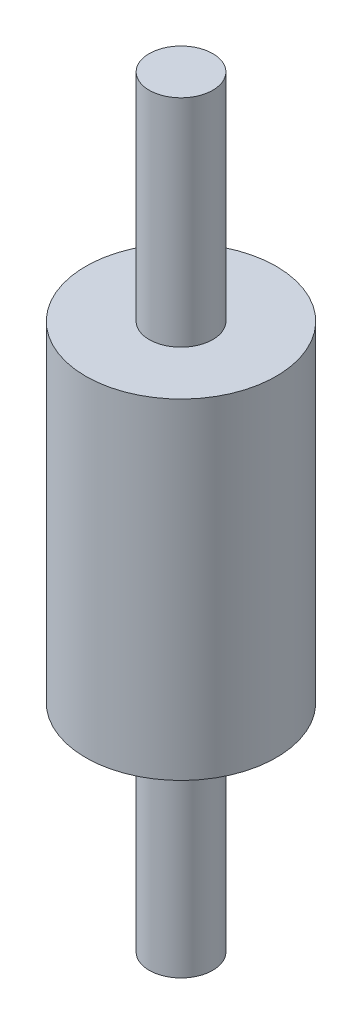
ISO-10303-21;
HEADER;
FILE_DESCRIPTION(('STEP AP214'),'2;1');
FILE_NAME('part.step','',(''),(''),'','','');
FILE_SCHEMA(('AUTOMOTIVE_DESIGN { 1 0 10303 214 1 1 1 1 }'));
ENDSEC;
DATA;
#1=APPLICATION_CONTEXT('core data for automotive mechanical design processes');
#2=APPLICATION_PROTOCOL_DEFINITION('international standard','automotive_design',2000,#1);
#3=PRODUCT_CONTEXT('',#1,'mechanical');
#4=PRODUCT('Part','Part','',(#3));
#5=PRODUCT_RELATED_PRODUCT_CATEGORY('part','',(#4));
#6=PRODUCT_DEFINITION_FORMATION('','',#4);
#7=PRODUCT_DEFINITION_CONTEXT('part definition',#1,'design');
#8=PRODUCT_DEFINITION('design','',#6,#7);
#9=PRODUCT_DEFINITION_SHAPE('','',#8);
#10=(LENGTH_UNIT() NAMED_UNIT(*) SI_UNIT(.MILLI.,.METRE.));
#11=(NAMED_UNIT(*) PLANE_ANGLE_UNIT() SI_UNIT($,.RADIAN.));
#12=(NAMED_UNIT(*) SI_UNIT($,.STERADIAN.) SOLID_ANGLE_UNIT());
#13=UNCERTAINTY_MEASURE_WITH_UNIT(LENGTH_MEASURE(1.E-05),#10,'distance_accuracy_value','');
#14=(GEOMETRIC_REPRESENTATION_CONTEXT(3) GLOBAL_UNCERTAINTY_ASSIGNED_CONTEXT((#13)) GLOBAL_UNIT_ASSIGNED_CONTEXT((#10,
#11,#12)) REPRESENTATION_CONTEXT('',''));
#15=CARTESIAN_POINT('',(0.,0.,0.));
#16=DIRECTION('',(0.,0.,1.));
#17=DIRECTION('',(1.,0.,0.));
#18=AXIS2_PLACEMENT_3D('',#15,#16,#17);
#19=CARTESIAN_POINT('',(0.,-30.,0.));
#20=DIRECTION('',(0.,-1.,0.));
#21=DIRECTION('',(0.,0.,-1.));
#22=AXIS2_PLACEMENT_3D('',#19,#20,#21);
#23=PLANE('',#22);
#24=CARTESIAN_POINT('',(0.,-30.,0.));
#25=DIRECTION('',(0.,-1.,0.));
#26=DIRECTION('',(0.,0.,-1.));
#27=AXIS2_PLACEMENT_3D('',#24,#25,#26);
#28=CIRCLE('',#27,2.5);
#29=CARTESIAN_POINT('',(0.,-30.,-2.5));
#30=VERTEX_POINT('',#29);
#31=EDGE_CURVE('E10',#30,#30,#28,.T.);
#32=ORIENTED_EDGE('',*,*,#31,.T.);
#33=EDGE_LOOP('',(#32));
#34=FACE_BOUND('',#33,.T.);
#35=ADVANCED_FACE('F35',(#34),#23,.T.);
#36=CARTESIAN_POINT('',(0.,0.,0.));
#37=DIRECTION('',(0.,-1.,0.));
#38=DIRECTION('',(0.,0.,-1.));
#39=AXIS2_PLACEMENT_3D('',#36,#37,#38);
#40=CYLINDRICAL_SURFACE('',#39,2.5);
#41=CARTESIAN_POINT('',(0.,-13.,0.));
#42=DIRECTION('',(0.,-1.,0.));
#43=DIRECTION('',(0.,0.,-1.));
#44=AXIS2_PLACEMENT_3D('',#41,#42,#43);
#45=CIRCLE('',#44,2.5);
#46=CARTESIAN_POINT('',(0.,-13.,-2.5));
#47=VERTEX_POINT('',#46);
#48=EDGE_CURVE('E41',#47,#47,#45,.T.);
#49=ORIENTED_EDGE('',*,*,#48,.T.);
#50=EDGE_LOOP('',(#49));
#51=FACE_BOUND('',#50,.T.);
#52=ORIENTED_EDGE('',*,*,#31,.F.);
#53=EDGE_LOOP('',(#52));
#54=FACE_BOUND('',#53,.T.);
#55=ADVANCED_FACE('F73',(#51,#54),#40,.T.);
#56=CARTESIAN_POINT('',(0.,-13.,-2.5));
#57=DIRECTION('',(0.,-1.,0.));
#58=DIRECTION('',(0.,0.,-1.));
#59=AXIS2_PLACEMENT_3D('',#56,#57,#58);
#60=PLANE('',#59);
#61=CARTESIAN_POINT('',(0.,-13.,0.));
#62=DIRECTION('',(0.,-1.,0.));
#63=DIRECTION('',(0.,0.,-1.));
#64=AXIS2_PLACEMENT_3D('',#61,#62,#63);
#65=CIRCLE('',#64,7.5);
#66=CARTESIAN_POINT('',(0.,-13.,-7.5));
#67=VERTEX_POINT('',#66);
#68=EDGE_CURVE('E45',#67,#67,#65,.T.);
#69=ORIENTED_EDGE('',*,*,#68,.T.);
#70=EDGE_LOOP('',(#69));
#71=FACE_BOUND('',#70,.T.);
#72=ORIENTED_EDGE('',*,*,#48,.F.);
#73=EDGE_LOOP('',(#72));
#74=FACE_BOUND('',#73,.T.);
#75=ADVANCED_FACE('F77',(#71,#74),#60,.T.);
#76=CARTESIAN_POINT('',(0.,0.,0.));
#77=DIRECTION('',(0.,-1.,0.));
#78=DIRECTION('',(0.,0.,-1.));
#79=AXIS2_PLACEMENT_3D('',#76,#77,#78);
#80=CYLINDRICAL_SURFACE('',#79,7.5);
#81=CARTESIAN_POINT('',(0.,13.,0.));
#82=DIRECTION('',(0.,-1.,0.));
#83=DIRECTION('',(0.,0.,-1.));
#84=AXIS2_PLACEMENT_3D('',#81,#82,#83);
#85=CIRCLE('',#84,7.5);
#86=CARTESIAN_POINT('',(0.,13.,-7.5));
#87=VERTEX_POINT('',#86);
#88=EDGE_CURVE('E49',#87,#87,#85,.T.);
#89=ORIENTED_EDGE('',*,*,#88,.T.);
#90=EDGE_LOOP('',(#89));
#91=FACE_BOUND('',#90,.T.);
#92=ORIENTED_EDGE('',*,*,#68,.F.);
#93=EDGE_LOOP('',(#92));
#94=FACE_BOUND('',#93,.T.);
#95=ADVANCED_FACE('F81',(#91,#94),#80,.T.);
#96=CARTESIAN_POINT('',(0.,13.,-7.5));
#97=DIRECTION('',(0.,1.,0.));
#98=DIRECTION('',(0.,0.,1.));
#99=AXIS2_PLACEMENT_3D('',#96,#97,#98);
#100=PLANE('',#99);
#101=CARTESIAN_POINT('',(0.,13.,0.));
#102=DIRECTION('',(0.,-1.,0.));
#103=DIRECTION('',(0.,0.,-1.));
#104=AXIS2_PLACEMENT_3D('',#101,#102,#103);
#105=CIRCLE('',#104,2.5);
#106=CARTESIAN_POINT('',(0.,13.,-2.5));
#107=VERTEX_POINT('',#106);
#108=EDGE_CURVE('E54',#107,#107,#105,.T.);
#109=ORIENTED_EDGE('',*,*,#108,.T.);
#110=EDGE_LOOP('',(#109));
#111=FACE_BOUND('',#110,.T.);
#112=ORIENTED_EDGE('',*,*,#88,.F.);
#113=EDGE_LOOP('',(#112));
#114=FACE_BOUND('',#113,.T.);
#115=ADVANCED_FACE('F70',(#111,#114),#100,.T.);
#116=CARTESIAN_POINT('',(0.,0.,0.));
#117=DIRECTION('',(0.,-1.,0.));
#118=DIRECTION('',(0.,0.,-1.));
#119=AXIS2_PLACEMENT_3D('',#116,#117,#118);
#120=CYLINDRICAL_SURFACE('',#119,2.5);
#121=CARTESIAN_POINT('',(0.,30.,0.));
#122=DIRECTION('',(0.,-1.,0.));
#123=DIRECTION('',(0.,0.,-1.));
#124=AXIS2_PLACEMENT_3D('',#121,#122,#123);
#125=CIRCLE('',#124,2.5);
#126=CARTESIAN_POINT('',(0.,30.,-2.5));
#127=VERTEX_POINT('',#126);
#128=EDGE_CURVE('E57',#127,#127,#125,.T.);
#129=ORIENTED_EDGE('',*,*,#128,.T.);
#130=EDGE_LOOP('',(#129));
#131=FACE_BOUND('',#130,.T.);
#132=ORIENTED_EDGE('',*,*,#108,.F.);
#133=EDGE_LOOP('',(#132));
#134=FACE_BOUND('',#133,.T.);
#135=ADVANCED_FACE('F61',(#131,#134),#120,.T.);
#136=CARTESIAN_POINT('',(0.,30.,-2.5));
#137=DIRECTION('',(0.,1.,0.));
#138=DIRECTION('',(0.,0.,1.));
#139=AXIS2_PLACEMENT_3D('',#136,#137,#138);
#140=PLANE('',#139);
#141=ORIENTED_EDGE('',*,*,#128,.F.);
#142=EDGE_LOOP('',(#141));
#143=FACE_BOUND('',#142,.T.);
#144=ADVANCED_FACE('F64',(#143),#140,.T.);
#145=CLOSED_SHELL('',(#35,#55,#75,#95,#115,#135,#144));
#146=MANIFOLD_SOLID_BREP('B2',#145);
#147=ADVANCED_BREP_SHAPE_REPRESENTATION('',(#18,#146),#14);
#148=SHAPE_DEFINITION_REPRESENTATION(#9,#147);
ENDSEC;
END-ISO-10303-21;
